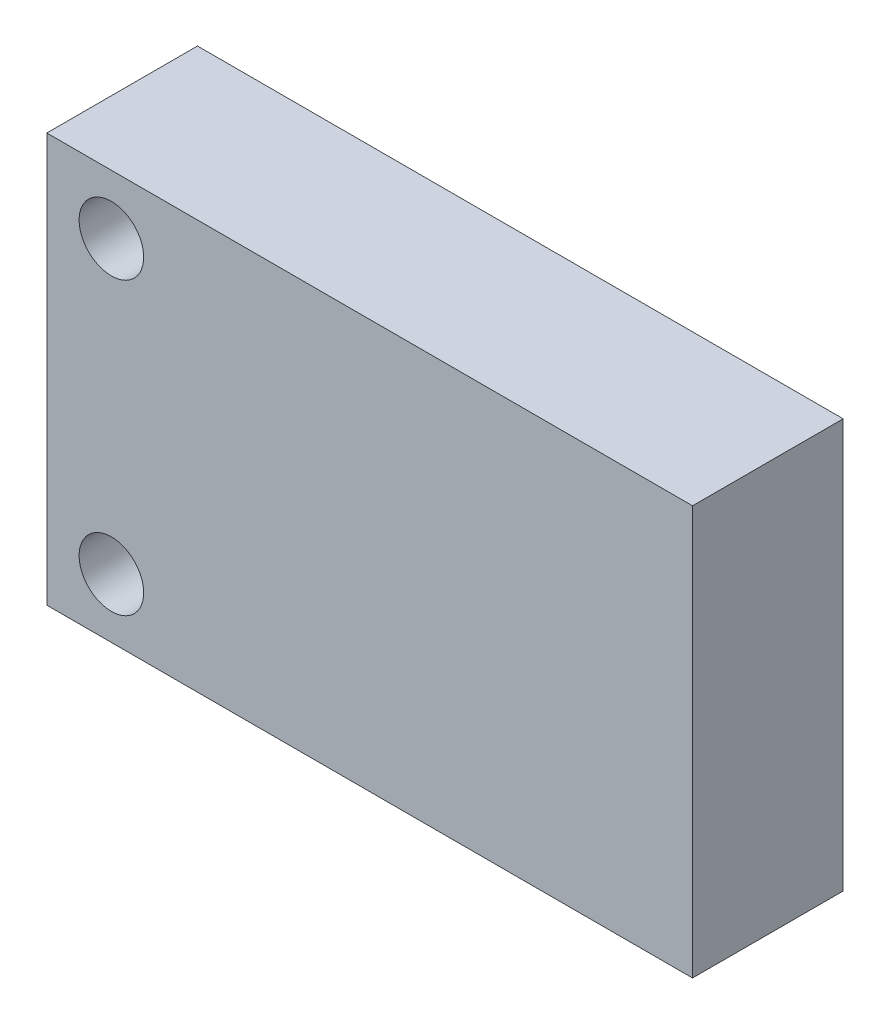
ISO-10303-21;
HEADER;
FILE_DESCRIPTION(('STEP AP214'),'2;1');
FILE_NAME('part.step','',(''),(''),'','','');
FILE_SCHEMA(('AUTOMOTIVE_DESIGN { 1 0 10303 214 1 1 1 1 }'));
ENDSEC;
DATA;
#1=APPLICATION_CONTEXT('core data for automotive mechanical design processes');
#2=APPLICATION_PROTOCOL_DEFINITION('international standard','automotive_design',2000,#1);
#3=PRODUCT_CONTEXT('',#1,'mechanical');
#4=PRODUCT('Part','Part','',(#3));
#5=PRODUCT_RELATED_PRODUCT_CATEGORY('part','',(#4));
#6=PRODUCT_DEFINITION_FORMATION('','',#4);
#7=PRODUCT_DEFINITION_CONTEXT('part definition',#1,'design');
#8=PRODUCT_DEFINITION('design','',#6,#7);
#9=PRODUCT_DEFINITION_SHAPE('','',#8);
#10=(LENGTH_UNIT() NAMED_UNIT(*) SI_UNIT(.MILLI.,.METRE.));
#11=(NAMED_UNIT(*) PLANE_ANGLE_UNIT() SI_UNIT($,.RADIAN.));
#12=(NAMED_UNIT(*) SI_UNIT($,.STERADIAN.) SOLID_ANGLE_UNIT());
#13=UNCERTAINTY_MEASURE_WITH_UNIT(LENGTH_MEASURE(1.E-05),#10,'distance_accuracy_value','');
#14=(GEOMETRIC_REPRESENTATION_CONTEXT(3) GLOBAL_UNCERTAINTY_ASSIGNED_CONTEXT((#13)) GLOBAL_UNIT_ASSIGNED_CONTEXT((#10,
#11,#12)) REPRESENTATION_CONTEXT('',''));
#15=CARTESIAN_POINT('',(0.,0.,0.));
#16=DIRECTION('',(0.,0.,1.));
#17=DIRECTION('',(1.,0.,0.));
#18=AXIS2_PLACEMENT_3D('',#15,#16,#17);
#19=CARTESIAN_POINT('',(15.,9.5,7.));
#20=DIRECTION('',(-1.,0.,0.));
#21=DIRECTION('',(0.,-1.,0.));
#22=AXIS2_PLACEMENT_3D('',#19,#20,#21);
#23=PLANE('',#22);
#24=DIRECTION('',(0.,1.,0.));
#25=VECTOR('',#24,1.);
#26=CARTESIAN_POINT('',(15.,9.5,0.));
#27=LINE('',#26,#25);
#28=CARTESIAN_POINT('',(15.,-9.5,0.));
#29=VERTEX_POINT('',#28);
#30=CARTESIAN_POINT('',(15.,9.5,0.));
#31=VERTEX_POINT('',#30);
#32=EDGE_CURVE('E98',#29,#31,#27,.T.);
#33=ORIENTED_EDGE('',*,*,#32,.T.);
#34=DIRECTION('',(0.,0.,-1.));
#35=VECTOR('',#34,1.);
#36=CARTESIAN_POINT('',(15.,9.5,7.));
#37=LINE('',#36,#35);
#38=CARTESIAN_POINT('',(15.,9.5,7.));
#39=VERTEX_POINT('',#38);
#40=EDGE_CURVE('E11',#39,#31,#37,.T.);
#41=ORIENTED_EDGE('',*,*,#40,.F.);
#42=DIRECTION('',(0.,1.,0.));
#43=VECTOR('',#42,1.);
#44=CARTESIAN_POINT('',(15.,9.5,7.));
#45=LINE('',#44,#43);
#46=CARTESIAN_POINT('',(15.,-9.5,7.));
#47=VERTEX_POINT('',#46);
#48=EDGE_CURVE('E86',#47,#39,#45,.T.);
#49=ORIENTED_EDGE('',*,*,#48,.F.);
#50=DIRECTION('',(0.,0.,-1.));
#51=VECTOR('',#50,1.);
#52=CARTESIAN_POINT('',(15.,-9.5,7.));
#53=LINE('',#52,#51);
#54=EDGE_CURVE('E94',#47,#29,#53,.T.);
#55=ORIENTED_EDGE('',*,*,#54,.T.);
#56=EDGE_LOOP('',(#33,#41,#49,#55));
#57=FACE_BOUND('',#56,.T.);
#58=ADVANCED_FACE('F35',(#57),#23,.F.);
#59=CARTESIAN_POINT('',(-15.,9.5,7.));
#60=DIRECTION('',(0.,-1.,0.));
#61=DIRECTION('',(0.,0.,-1.));
#62=AXIS2_PLACEMENT_3D('',#59,#60,#61);
#63=PLANE('',#62);
#64=DIRECTION('',(-1.,0.,0.));
#65=VECTOR('',#64,1.);
#66=CARTESIAN_POINT('',(-15.,9.5,0.));
#67=LINE('',#66,#65);
#68=CARTESIAN_POINT('',(-15.,9.5,0.));
#69=VERTEX_POINT('',#68);
#70=EDGE_CURVE('E90',#31,#69,#67,.T.);
#71=ORIENTED_EDGE('',*,*,#70,.T.);
#72=DIRECTION('',(0.,0.,-1.));
#73=VECTOR('',#72,1.);
#74=CARTESIAN_POINT('',(-15.,9.5,7.));
#75=LINE('',#74,#73);
#76=CARTESIAN_POINT('',(-15.,9.5,7.));
#77=VERTEX_POINT('',#76);
#78=EDGE_CURVE('E43',#77,#69,#75,.T.);
#79=ORIENTED_EDGE('',*,*,#78,.F.);
#80=DIRECTION('',(-1.,0.,0.));
#81=VECTOR('',#80,1.);
#82=CARTESIAN_POINT('',(-15.,9.5,7.));
#83=LINE('',#82,#81);
#84=EDGE_CURVE('E81',#39,#77,#83,.T.);
#85=ORIENTED_EDGE('',*,*,#84,.F.);
#86=ORIENTED_EDGE('',*,*,#40,.T.);
#87=EDGE_LOOP('',(#71,#79,#85,#86));
#88=FACE_BOUND('',#87,.T.);
#89=ADVANCED_FACE('F89',(#88),#63,.F.);
#90=CARTESIAN_POINT('',(-15.,9.5,7.));
#91=DIRECTION('',(1.,0.,0.));
#92=DIRECTION('',(0.,1.,0.));
#93=AXIS2_PLACEMENT_3D('',#90,#91,#92);
#94=PLANE('',#93);
#95=DIRECTION('',(0.,-1.,0.));
#96=VECTOR('',#95,1.);
#97=CARTESIAN_POINT('',(-15.,9.5,0.));
#98=LINE('',#97,#96);
#99=CARTESIAN_POINT('',(-15.,-9.5,0.));
#100=VERTEX_POINT('',#99);
#101=EDGE_CURVE('E68',#69,#100,#98,.T.);
#102=ORIENTED_EDGE('',*,*,#101,.T.);
#103=DIRECTION('',(0.,0.,-1.));
#104=VECTOR('',#103,1.);
#105=CARTESIAN_POINT('',(-15.,-9.5,7.));
#106=LINE('',#105,#104);
#107=CARTESIAN_POINT('',(-15.,-9.5,7.));
#108=VERTEX_POINT('',#107);
#109=EDGE_CURVE('E91',#108,#100,#106,.T.);
#110=ORIENTED_EDGE('',*,*,#109,.F.);
#111=DIRECTION('',(0.,-1.,0.));
#112=VECTOR('',#111,1.);
#113=CARTESIAN_POINT('',(-15.,9.5,7.));
#114=LINE('',#113,#112);
#115=EDGE_CURVE('E84',#77,#108,#114,.T.);
#116=ORIENTED_EDGE('',*,*,#115,.F.);
#117=ORIENTED_EDGE('',*,*,#78,.T.);
#118=EDGE_LOOP('',(#102,#110,#116,#117));
#119=FACE_BOUND('',#118,.T.);
#120=ADVANCED_FACE('F92',(#119),#94,.F.);
#121=CARTESIAN_POINT('',(-15.,-9.5,7.));
#122=DIRECTION('',(0.,1.,0.));
#123=DIRECTION('',(0.,0.,1.));
#124=AXIS2_PLACEMENT_3D('',#121,#122,#123);
#125=PLANE('',#124);
#126=DIRECTION('',(1.,0.,0.));
#127=VECTOR('',#126,1.);
#128=CARTESIAN_POINT('',(-15.,-9.5,0.));
#129=LINE('',#128,#127);
#130=EDGE_CURVE('E74',#100,#29,#129,.T.);
#131=ORIENTED_EDGE('',*,*,#130,.T.);
#132=ORIENTED_EDGE('',*,*,#54,.F.);
#133=DIRECTION('',(1.,0.,0.));
#134=VECTOR('',#133,1.);
#135=CARTESIAN_POINT('',(-15.,-9.5,7.));
#136=LINE('',#135,#134);
#137=EDGE_CURVE('E51',#108,#47,#136,.T.);
#138=ORIENTED_EDGE('',*,*,#137,.F.);
#139=ORIENTED_EDGE('',*,*,#109,.T.);
#140=EDGE_LOOP('',(#131,#132,#138,#139));
#141=FACE_BOUND('',#140,.T.);
#142=ADVANCED_FACE('F106',(#141),#125,.F.);
#143=CARTESIAN_POINT('',(0.,0.,7.));
#144=DIRECTION('',(0.,0.,1.));
#145=DIRECTION('',(1.,0.,0.));
#146=AXIS2_PLACEMENT_3D('',#143,#144,#145);
#147=PLANE('',#146);
#148=CARTESIAN_POINT('',(-12.,-6.75,7.));
#149=DIRECTION('',(0.,0.,1.));
#150=DIRECTION('',(1.,0.,0.));
#151=AXIS2_PLACEMENT_3D('',#148,#149,#150);
#152=CIRCLE('',#151,1.5);
#153=CARTESIAN_POINT('',(-10.5,-6.75,7.));
#154=VERTEX_POINT('',#153);
#155=EDGE_CURVE('E118',#154,#154,#152,.T.);
#156=ORIENTED_EDGE('',*,*,#155,.F.);
#157=EDGE_LOOP('',(#156));
#158=FACE_BOUND('',#157,.T.);
#159=CARTESIAN_POINT('',(-12.,6.75,7.));
#160=DIRECTION('',(0.,0.,1.));
#161=DIRECTION('',(1.,0.,0.));
#162=AXIS2_PLACEMENT_3D('',#159,#160,#161);
#163=CIRCLE('',#162,1.5);
#164=CARTESIAN_POINT('',(-10.5,6.75,7.));
#165=VERTEX_POINT('',#164);
#166=EDGE_CURVE('E112',#165,#165,#163,.T.);
#167=ORIENTED_EDGE('',*,*,#166,.F.);
#168=EDGE_LOOP('',(#167));
#169=FACE_BOUND('',#168,.T.);
#170=ORIENTED_EDGE('',*,*,#48,.T.);
#171=ORIENTED_EDGE('',*,*,#84,.T.);
#172=ORIENTED_EDGE('',*,*,#115,.T.);
#173=ORIENTED_EDGE('',*,*,#137,.T.);
#174=EDGE_LOOP('',(#170,#171,#172,#173));
#175=FACE_BOUND('',#174,.T.);
#176=ADVANCED_FACE('F82',(#158,#169,#175),#147,.T.);
#177=CARTESIAN_POINT('',(0.,0.,0.));
#178=DIRECTION('',(0.,0.,1.));
#179=DIRECTION('',(1.,0.,0.));
#180=AXIS2_PLACEMENT_3D('',#177,#178,#179);
#181=PLANE('',#180);
#182=CARTESIAN_POINT('',(-12.,-6.75,0.));
#183=DIRECTION('',(0.,0.,1.));
#184=DIRECTION('',(1.,0.,0.));
#185=AXIS2_PLACEMENT_3D('',#182,#183,#184);
#186=CIRCLE('',#185,1.5);
#187=CARTESIAN_POINT('',(-10.5,-6.75,0.));
#188=VERTEX_POINT('',#187);
#189=EDGE_CURVE('E115',#188,#188,#186,.T.);
#190=ORIENTED_EDGE('',*,*,#189,.T.);
#191=EDGE_LOOP('',(#190));
#192=FACE_BOUND('',#191,.T.);
#193=CARTESIAN_POINT('',(-12.,6.75,0.));
#194=DIRECTION('',(0.,0.,1.));
#195=DIRECTION('',(1.,0.,0.));
#196=AXIS2_PLACEMENT_3D('',#193,#194,#195);
#197=CIRCLE('',#196,1.5);
#198=CARTESIAN_POINT('',(-10.5,6.75,0.));
#199=VERTEX_POINT('',#198);
#200=EDGE_CURVE('E101',#199,#199,#197,.T.);
#201=ORIENTED_EDGE('',*,*,#200,.T.);
#202=EDGE_LOOP('',(#201));
#203=FACE_BOUND('',#202,.T.);
#204=ORIENTED_EDGE('',*,*,#32,.F.);
#205=ORIENTED_EDGE('',*,*,#130,.F.);
#206=ORIENTED_EDGE('',*,*,#101,.F.);
#207=ORIENTED_EDGE('',*,*,#70,.F.);
#208=EDGE_LOOP('',(#204,#205,#206,#207));
#209=FACE_BOUND('',#208,.T.);
#210=ADVANCED_FACE('F109',(#192,#203,#209),#181,.F.);
#211=CARTESIAN_POINT('',(-12.,6.75,0.));
#212=DIRECTION('',(0.,0.,1.));
#213=DIRECTION('',(1.,0.,0.));
#214=AXIS2_PLACEMENT_3D('',#211,#212,#213);
#215=CYLINDRICAL_SURFACE('',#214,1.5);
#216=ORIENTED_EDGE('',*,*,#200,.F.);
#217=EDGE_LOOP('',(#216));
#218=FACE_BOUND('',#217,.T.);
#219=ORIENTED_EDGE('',*,*,#166,.T.);
#220=EDGE_LOOP('',(#219));
#221=FACE_BOUND('',#220,.T.);
#222=ADVANCED_FACE('F129',(#218,#221),#215,.F.);
#223=CARTESIAN_POINT('',(-12.,-6.75,0.));
#224=DIRECTION('',(0.,0.,1.));
#225=DIRECTION('',(1.,0.,0.));
#226=AXIS2_PLACEMENT_3D('',#223,#224,#225);
#227=CYLINDRICAL_SURFACE('',#226,1.5);
#228=ORIENTED_EDGE('',*,*,#189,.F.);
#229=EDGE_LOOP('',(#228));
#230=FACE_BOUND('',#229,.T.);
#231=ORIENTED_EDGE('',*,*,#155,.T.);
#232=EDGE_LOOP('',(#231));
#233=FACE_BOUND('',#232,.T.);
#234=ADVANCED_FACE('F126',(#230,#233),#227,.F.);
#235=CLOSED_SHELL('',(#58,#89,#120,#142,#176,#210,#222,#234));
#236=MANIFOLD_SOLID_BREP('B2',#235);
#237=ADVANCED_BREP_SHAPE_REPRESENTATION('',(#18,#236),#14);
#238=SHAPE_DEFINITION_REPRESENTATION(#9,#237);
ENDSEC;
END-ISO-10303-21;
